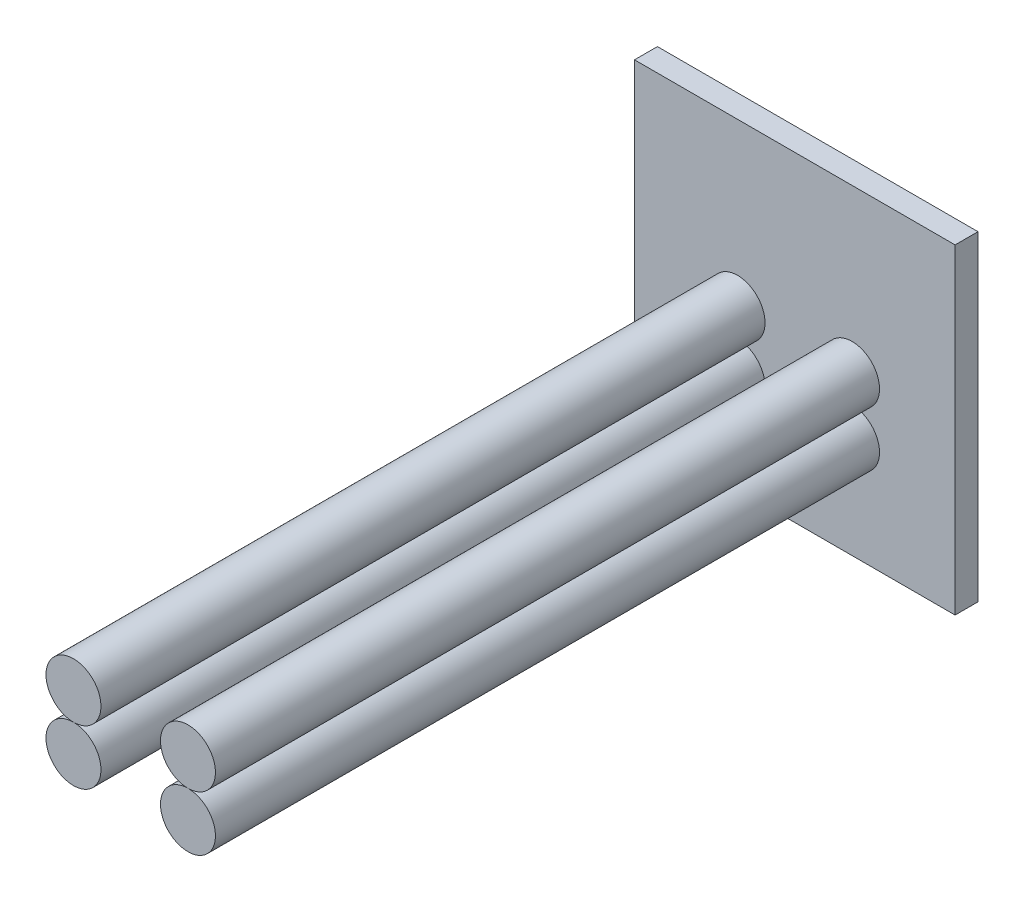
ISO-10303-21;
HEADER;
FILE_DESCRIPTION(('STEP AP214'),'2;1');
FILE_NAME('part.step','',(''),(''),'','','');
FILE_SCHEMA(('AUTOMOTIVE_DESIGN { 1 0 10303 214 1 1 1 1 }'));
ENDSEC;
DATA;
#1=APPLICATION_CONTEXT('core data for automotive mechanical design processes');
#2=APPLICATION_PROTOCOL_DEFINITION('international standard','automotive_design',2000,#1);
#3=PRODUCT_CONTEXT('',#1,'mechanical');
#4=PRODUCT('Part','Part','',(#3));
#5=PRODUCT_RELATED_PRODUCT_CATEGORY('part','',(#4));
#6=PRODUCT_DEFINITION_FORMATION('','',#4);
#7=PRODUCT_DEFINITION_CONTEXT('part definition',#1,'design');
#8=PRODUCT_DEFINITION('design','',#6,#7);
#9=PRODUCT_DEFINITION_SHAPE('','',#8);
#10=(LENGTH_UNIT() NAMED_UNIT(*) SI_UNIT(.MILLI.,.METRE.));
#11=(NAMED_UNIT(*) PLANE_ANGLE_UNIT() SI_UNIT($,.RADIAN.));
#12=(NAMED_UNIT(*) SI_UNIT($,.STERADIAN.) SOLID_ANGLE_UNIT());
#13=UNCERTAINTY_MEASURE_WITH_UNIT(LENGTH_MEASURE(1.E-05),#10,'distance_accuracy_value','');
#14=(GEOMETRIC_REPRESENTATION_CONTEXT(3) GLOBAL_UNCERTAINTY_ASSIGNED_CONTEXT((#13)) GLOBAL_UNIT_ASSIGNED_CONTEXT((#10,
#11,#12)) REPRESENTATION_CONTEXT('',''));
#15=CARTESIAN_POINT('',(0.,0.,0.));
#16=DIRECTION('',(0.,0.,1.));
#17=DIRECTION('',(1.,0.,0.));
#18=AXIS2_PLACEMENT_3D('',#15,#16,#17);
#19=CARTESIAN_POINT('',(0.,3.5,0.));
#20=DIRECTION('',(0.,0.,-1.));
#21=DIRECTION('',(0.,-1.,0.));
#22=AXIS2_PLACEMENT_3D('',#19,#20,#21);
#23=PLANE('',#22);
#24=DIRECTION('',(1.,0.,0.));
#25=VECTOR('',#24,1.);
#26=CARTESIAN_POINT('',(-3.5,7.000000000001,0.));
#27=LINE('',#26,#25);
#28=CARTESIAN_POINT('',(-3.5,7.000000000001,0.));
#29=VERTEX_POINT('',#28);
#30=CARTESIAN_POINT('',(3.5,7.000000000001,0.));
#31=VERTEX_POINT('',#30);
#32=EDGE_CURVE('E121',#29,#31,#27,.T.);
#33=ORIENTED_EDGE('',*,*,#32,.T.);
#34=DIRECTION('',(0.,-1.,0.));
#35=VECTOR('',#34,1.);
#36=CARTESIAN_POINT('',(3.5,7.000000000001,0.));
#37=LINE('',#36,#35);
#38=CARTESIAN_POINT('',(3.5,0.,0.));
#39=VERTEX_POINT('',#38);
#40=EDGE_CURVE('E107',#31,#39,#37,.T.);
#41=ORIENTED_EDGE('',*,*,#40,.T.);
#42=DIRECTION('',(-1.,0.,0.));
#43=VECTOR('',#42,1.);
#44=CARTESIAN_POINT('',(3.5,0.,0.));
#45=LINE('',#44,#43);
#46=CARTESIAN_POINT('',(-3.5,0.,0.));
#47=VERTEX_POINT('',#46);
#48=EDGE_CURVE('E162',#39,#47,#45,.T.);
#49=ORIENTED_EDGE('',*,*,#48,.T.);
#50=DIRECTION('',(0.,1.,0.));
#51=VECTOR('',#50,1.);
#52=CARTESIAN_POINT('',(-3.5,0.,0.));
#53=LINE('',#52,#51);
#54=EDGE_CURVE('E123',#47,#29,#53,.T.);
#55=ORIENTED_EDGE('',*,*,#54,.T.);
#56=EDGE_LOOP('',(#33,#41,#49,#55));
#57=FACE_BOUND('',#56,.T.);
#58=ADVANCED_FACE('F19',(#57),#23,.T.);
#59=CARTESIAN_POINT('',(-1.25,3.45,15.));
#60=DIRECTION('',(0.,0.,1.));
#61=DIRECTION('',(1.,0.,0.));
#62=AXIS2_PLACEMENT_3D('',#59,#60,#61);
#63=PLANE('',#62);
#64=CARTESIAN_POINT('',(-1.25,3.45,15.));
#65=DIRECTION('',(0.,0.,1.));
#66=DIRECTION('',(1.,0.,0.));
#67=AXIS2_PLACEMENT_3D('',#64,#65,#66);
#68=CIRCLE('',#67,0.6);
#69=CARTESIAN_POINT('',(-1.85,3.45,15.));
#70=VERTEX_POINT('',#69);
#71=EDGE_CURVE('E11',#70,#70,#68,.T.);
#72=ORIENTED_EDGE('',*,*,#71,.T.);
#73=EDGE_LOOP('',(#72));
#74=FACE_BOUND('',#73,.T.);
#75=ADVANCED_FACE('F305',(#74),#63,.T.);
#76=CARTESIAN_POINT('',(1.25,3.45,15.));
#77=DIRECTION('',(0.,0.,1.));
#78=DIRECTION('',(1.,0.,0.));
#79=AXIS2_PLACEMENT_3D('',#76,#77,#78);
#80=PLANE('',#79);
#81=CARTESIAN_POINT('',(1.25,3.45,15.));
#82=DIRECTION('',(0.,0.,1.));
#83=DIRECTION('',(1.,0.,0.));
#84=AXIS2_PLACEMENT_3D('',#81,#82,#83);
#85=CIRCLE('',#84,0.6);
#86=CARTESIAN_POINT('',(0.65,3.45,15.));
#87=VERTEX_POINT('',#86);
#88=EDGE_CURVE('E178',#87,#87,#85,.T.);
#89=ORIENTED_EDGE('',*,*,#88,.T.);
#90=EDGE_LOOP('',(#89));
#91=FACE_BOUND('',#90,.T.);
#92=ADVANCED_FACE('F313',(#91),#80,.T.);
#93=CARTESIAN_POINT('',(-1.25,2.25,15.));
#94=DIRECTION('',(0.,0.,1.));
#95=DIRECTION('',(1.,0.,0.));
#96=AXIS2_PLACEMENT_3D('',#93,#94,#95);
#97=PLANE('',#96);
#98=CARTESIAN_POINT('',(-1.25,2.25,15.));
#99=DIRECTION('',(0.,0.,1.));
#100=DIRECTION('',(1.,0.,0.));
#101=AXIS2_PLACEMENT_3D('',#98,#99,#100);
#102=CIRCLE('',#101,0.6);
#103=CARTESIAN_POINT('',(-1.85,2.25,15.));
#104=VERTEX_POINT('',#103);
#105=EDGE_CURVE('E149',#104,#104,#102,.T.);
#106=ORIENTED_EDGE('',*,*,#105,.T.);
#107=EDGE_LOOP('',(#106));
#108=FACE_BOUND('',#107,.T.);
#109=ADVANCED_FACE('F295',(#108),#97,.T.);
#110=CARTESIAN_POINT('',(1.25,2.25,15.));
#111=DIRECTION('',(0.,0.,1.));
#112=DIRECTION('',(1.,0.,0.));
#113=AXIS2_PLACEMENT_3D('',#110,#111,#112);
#114=PLANE('',#113);
#115=CARTESIAN_POINT('',(1.25,2.25,15.));
#116=DIRECTION('',(0.,0.,1.));
#117=DIRECTION('',(1.,0.,0.));
#118=AXIS2_PLACEMENT_3D('',#115,#116,#117);
#119=CIRCLE('',#118,0.6);
#120=CARTESIAN_POINT('',(0.65,2.25,15.));
#121=VERTEX_POINT('',#120);
#122=EDGE_CURVE('E150',#121,#121,#119,.T.);
#123=ORIENTED_EDGE('',*,*,#122,.T.);
#124=EDGE_LOOP('',(#123));
#125=FACE_BOUND('',#124,.T.);
#126=ADVANCED_FACE('F208',(#125),#114,.T.);
#127=CARTESIAN_POINT('',(-1.25,3.45,0.));
#128=DIRECTION('',(0.,0.,-1.));
#129=DIRECTION('',(1.,0.,0.));
#130=AXIS2_PLACEMENT_3D('',#127,#128,#129);
#131=CYLINDRICAL_SURFACE('',#130,0.6);
#132=CARTESIAN_POINT('',(-1.25,3.45,0.5));
#133=DIRECTION('',(0.,0.,-1.));
#134=DIRECTION('',(1.,0.,0.));
#135=AXIS2_PLACEMENT_3D('',#132,#133,#134);
#136=CIRCLE('',#135,0.6);
#137=CARTESIAN_POINT('',(-1.25,2.85,0.5));
#138=VERTEX_POINT('',#137);
#139=CARTESIAN_POINT('',(-1.85,3.45,0.5));
#140=VERTEX_POINT('',#139);
#141=EDGE_CURVE('E163',#138,#140,#136,.T.);
#142=ORIENTED_EDGE('',*,*,#141,.F.);
#143=CARTESIAN_POINT('',(-1.25,3.45,0.5));
#144=DIRECTION('',(0.,0.,-1.));
#145=DIRECTION('',(1.,0.,0.));
#146=AXIS2_PLACEMENT_3D('',#143,#144,#145);
#147=CIRCLE('',#146,0.6);
#148=EDGE_CURVE('E159',#140,#138,#147,.T.);
#149=ORIENTED_EDGE('',*,*,#148,.F.);
#150=DIRECTION('',(0.,0.,1.));
#151=VECTOR('',#150,1.);
#152=CARTESIAN_POINT('',(-1.85,3.45,0.));
#153=LINE('',#152,#151);
#154=EDGE_CURVE('E30',#140,#70,#153,.T.);
#155=ORIENTED_EDGE('',*,*,#154,.T.);
#156=ORIENTED_EDGE('',*,*,#71,.F.);
#157=ORIENTED_EDGE('',*,*,#154,.F.);
#158=EDGE_LOOP('',(#142,#149,#155,#156,#157));
#159=FACE_BOUND('',#158,.T.);
#160=ADVANCED_FACE('F294',(#159),#131,.T.);
#161=CARTESIAN_POINT('',(1.25,3.45,0.));
#162=DIRECTION('',(0.,0.,-1.));
#163=DIRECTION('',(1.,0.,0.));
#164=AXIS2_PLACEMENT_3D('',#161,#162,#163);
#165=CYLINDRICAL_SURFACE('',#164,0.6);
#166=CARTESIAN_POINT('',(1.25,3.45,0.5));
#167=DIRECTION('',(0.,0.,-1.));
#168=DIRECTION('',(1.,0.,0.));
#169=AXIS2_PLACEMENT_3D('',#166,#167,#168);
#170=CIRCLE('',#169,0.6);
#171=CARTESIAN_POINT('',(1.25,2.85,0.5));
#172=VERTEX_POINT('',#171);
#173=CARTESIAN_POINT('',(0.65,3.45,0.5));
#174=VERTEX_POINT('',#173);
#175=EDGE_CURVE('E151',#172,#174,#170,.T.);
#176=ORIENTED_EDGE('',*,*,#175,.F.);
#177=CARTESIAN_POINT('',(1.25,3.45,0.5));
#178=DIRECTION('',(0.,0.,-1.));
#179=DIRECTION('',(1.,0.,0.));
#180=AXIS2_PLACEMENT_3D('',#177,#178,#179);
#181=CIRCLE('',#180,0.6);
#182=EDGE_CURVE('E143',#174,#172,#181,.T.);
#183=ORIENTED_EDGE('',*,*,#182,.F.);
#184=DIRECTION('',(0.,0.,1.));
#185=VECTOR('',#184,1.);
#186=CARTESIAN_POINT('',(0.65,3.45,0.));
#187=LINE('',#186,#185);
#188=EDGE_CURVE('E180',#174,#87,#187,.T.);
#189=ORIENTED_EDGE('',*,*,#188,.T.);
#190=ORIENTED_EDGE('',*,*,#88,.F.);
#191=ORIENTED_EDGE('',*,*,#188,.F.);
#192=EDGE_LOOP('',(#176,#183,#189,#190,#191));
#193=FACE_BOUND('',#192,.T.);
#194=ADVANCED_FACE('F336',(#193),#165,.T.);
#195=CARTESIAN_POINT('',(-1.25,2.25,0.));
#196=DIRECTION('',(0.,0.,-1.));
#197=DIRECTION('',(1.,0.,0.));
#198=AXIS2_PLACEMENT_3D('',#195,#196,#197);
#199=CYLINDRICAL_SURFACE('',#198,0.6);
#200=CARTESIAN_POINT('',(-1.25,2.25,0.5));
#201=DIRECTION('',(0.,0.,-1.));
#202=DIRECTION('',(1.,0.,0.));
#203=AXIS2_PLACEMENT_3D('',#200,#201,#202);
#204=CIRCLE('',#203,0.6);
#205=CARTESIAN_POINT('',(-1.85,2.25,0.5));
#206=VERTEX_POINT('',#205);
#207=EDGE_CURVE('E167',#138,#206,#204,.T.);
#208=ORIENTED_EDGE('',*,*,#207,.F.);
#209=CARTESIAN_POINT('',(-1.25,2.25,0.5));
#210=DIRECTION('',(0.,0.,-1.));
#211=DIRECTION('',(1.,0.,0.));
#212=AXIS2_PLACEMENT_3D('',#209,#210,#211);
#213=CIRCLE('',#212,0.6);
#214=EDGE_CURVE('E171',#206,#138,#213,.T.);
#215=ORIENTED_EDGE('',*,*,#214,.F.);
#216=DIRECTION('',(0.,0.,1.));
#217=VECTOR('',#216,1.);
#218=CARTESIAN_POINT('',(-1.85,2.25,0.));
#219=LINE('',#218,#217);
#220=EDGE_CURVE('E145',#206,#104,#219,.T.);
#221=ORIENTED_EDGE('',*,*,#220,.T.);
#222=ORIENTED_EDGE('',*,*,#105,.F.);
#223=ORIENTED_EDGE('',*,*,#220,.F.);
#224=EDGE_LOOP('',(#208,#215,#221,#222,#223));
#225=FACE_BOUND('',#224,.T.);
#226=ADVANCED_FACE('F341',(#225),#199,.T.);
#227=CARTESIAN_POINT('',(1.25,2.25,0.));
#228=DIRECTION('',(0.,0.,-1.));
#229=DIRECTION('',(1.,0.,0.));
#230=AXIS2_PLACEMENT_3D('',#227,#228,#229);
#231=CYLINDRICAL_SURFACE('',#230,0.6);
#232=CARTESIAN_POINT('',(1.25,2.25,0.5));
#233=DIRECTION('',(0.,0.,-1.));
#234=DIRECTION('',(1.,0.,0.));
#235=AXIS2_PLACEMENT_3D('',#232,#233,#234);
#236=CIRCLE('',#235,0.6);
#237=CARTESIAN_POINT('',(0.65,2.25,0.5));
#238=VERTEX_POINT('',#237);
#239=EDGE_CURVE('E166',#172,#238,#236,.T.);
#240=ORIENTED_EDGE('',*,*,#239,.F.);
#241=CARTESIAN_POINT('',(1.25,2.25,0.5));
#242=DIRECTION('',(0.,0.,-1.));
#243=DIRECTION('',(1.,0.,0.));
#244=AXIS2_PLACEMENT_3D('',#241,#242,#243);
#245=CIRCLE('',#244,0.6);
#246=EDGE_CURVE('E23',#238,#172,#245,.T.);
#247=ORIENTED_EDGE('',*,*,#246,.F.);
#248=DIRECTION('',(0.,0.,1.));
#249=VECTOR('',#248,1.);
#250=CARTESIAN_POINT('',(0.65,2.25,0.));
#251=LINE('',#250,#249);
#252=EDGE_CURVE('E199',#238,#121,#251,.T.);
#253=ORIENTED_EDGE('',*,*,#252,.T.);
#254=ORIENTED_EDGE('',*,*,#122,.F.);
#255=ORIENTED_EDGE('',*,*,#252,.F.);
#256=EDGE_LOOP('',(#240,#247,#253,#254,#255));
#257=FACE_BOUND('',#256,.T.);
#258=ADVANCED_FACE('F21',(#257),#231,.T.);
#259=CARTESIAN_POINT('',(3.5,0.,0.));
#260=DIRECTION('',(0.,-1.,0.));
#261=DIRECTION('',(0.,0.,-1.));
#262=AXIS2_PLACEMENT_3D('',#259,#260,#261);
#263=PLANE('',#262);
#264=DIRECTION('',(0.,0.,1.));
#265=VECTOR('',#264,1.);
#266=CARTESIAN_POINT('',(3.5,0.,0.));
#267=LINE('',#266,#265);
#268=CARTESIAN_POINT('',(3.5,0.,0.5));
#269=VERTEX_POINT('',#268);
#270=EDGE_CURVE('E115',#39,#269,#267,.T.);
#271=ORIENTED_EDGE('',*,*,#270,.T.);
#272=DIRECTION('',(-1.,0.,0.));
#273=VECTOR('',#272,1.);
#274=CARTESIAN_POINT('',(3.5,0.,0.5));
#275=LINE('',#274,#273);
#276=CARTESIAN_POINT('',(-3.5,0.,0.5));
#277=VERTEX_POINT('',#276);
#278=EDGE_CURVE('E118',#269,#277,#275,.T.);
#279=ORIENTED_EDGE('',*,*,#278,.T.);
#280=DIRECTION('',(0.,0.,1.));
#281=VECTOR('',#280,1.);
#282=CARTESIAN_POINT('',(-3.5,0.,0.));
#283=LINE('',#282,#281);
#284=EDGE_CURVE('E128',#47,#277,#283,.T.);
#285=ORIENTED_EDGE('',*,*,#284,.F.);
#286=ORIENTED_EDGE('',*,*,#48,.F.);
#287=EDGE_LOOP('',(#271,#279,#285,#286));
#288=FACE_BOUND('',#287,.T.);
#289=ADVANCED_FACE('F238',(#288),#263,.T.);
#290=CARTESIAN_POINT('',(0.,3.5,0.5));
#291=DIRECTION('',(0.,0.,-1.));
#292=DIRECTION('',(0.,-1.,0.));
#293=AXIS2_PLACEMENT_3D('',#290,#291,#292);
#294=PLANE('',#293);
#295=ORIENTED_EDGE('',*,*,#207,.T.);
#296=ORIENTED_EDGE('',*,*,#214,.T.);
#297=ORIENTED_EDGE('',*,*,#141,.T.);
#298=ORIENTED_EDGE('',*,*,#148,.T.);
#299=EDGE_LOOP('',(#295,#296,#297,#298));
#300=FACE_BOUND('',#299,.T.);
#301=ORIENTED_EDGE('',*,*,#239,.T.);
#302=ORIENTED_EDGE('',*,*,#246,.T.);
#303=ORIENTED_EDGE('',*,*,#175,.T.);
#304=ORIENTED_EDGE('',*,*,#182,.T.);
#305=EDGE_LOOP('',(#301,#302,#303,#304));
#306=FACE_BOUND('',#305,.T.);
#307=DIRECTION('',(1.,0.,0.));
#308=VECTOR('',#307,1.);
#309=CARTESIAN_POINT('',(-3.5,7.000000000001,0.5));
#310=LINE('',#309,#308);
#311=CARTESIAN_POINT('',(-3.5,7.000000000001,0.5));
#312=VERTEX_POINT('',#311);
#313=CARTESIAN_POINT('',(3.5,7.000000000001,0.5));
#314=VERTEX_POINT('',#313);
#315=EDGE_CURVE('E132',#312,#314,#310,.T.);
#316=ORIENTED_EDGE('',*,*,#315,.F.);
#317=DIRECTION('',(0.,1.,0.));
#318=VECTOR('',#317,1.);
#319=CARTESIAN_POINT('',(-3.5,0.,0.5));
#320=LINE('',#319,#318);
#321=EDGE_CURVE('E158',#277,#312,#320,.T.);
#322=ORIENTED_EDGE('',*,*,#321,.F.);
#323=ORIENTED_EDGE('',*,*,#278,.F.);
#324=DIRECTION('',(0.,-1.,0.));
#325=VECTOR('',#324,1.);
#326=CARTESIAN_POINT('',(3.5,7.000000000001,0.5));
#327=LINE('',#326,#325);
#328=EDGE_CURVE('E173',#314,#269,#327,.T.);
#329=ORIENTED_EDGE('',*,*,#328,.F.);
#330=EDGE_LOOP('',(#316,#322,#323,#329));
#331=FACE_BOUND('',#330,.T.);
#332=ADVANCED_FACE('F216',(#300,#306,#331),#294,.F.);
#333=CARTESIAN_POINT('',(3.5,7.000000000001,0.));
#334=DIRECTION('',(1.,0.,0.));
#335=DIRECTION('',(0.,1.,0.));
#336=AXIS2_PLACEMENT_3D('',#333,#334,#335);
#337=PLANE('',#336);
#338=DIRECTION('',(0.,0.,1.));
#339=VECTOR('',#338,1.);
#340=CARTESIAN_POINT('',(3.5,7.000000000001,0.));
#341=LINE('',#340,#339);
#342=EDGE_CURVE('E112',#31,#314,#341,.T.);
#343=ORIENTED_EDGE('',*,*,#342,.T.);
#344=ORIENTED_EDGE('',*,*,#328,.T.);
#345=ORIENTED_EDGE('',*,*,#270,.F.);
#346=ORIENTED_EDGE('',*,*,#40,.F.);
#347=EDGE_LOOP('',(#343,#344,#345,#346));
#348=FACE_BOUND('',#347,.T.);
#349=ADVANCED_FACE('F109',(#348),#337,.T.);
#350=CARTESIAN_POINT('',(-3.5,0.,0.));
#351=DIRECTION('',(-1.,0.,0.));
#352=DIRECTION('',(0.,0.,1.));
#353=AXIS2_PLACEMENT_3D('',#350,#351,#352);
#354=PLANE('',#353);
#355=ORIENTED_EDGE('',*,*,#284,.T.);
#356=ORIENTED_EDGE('',*,*,#321,.T.);
#357=DIRECTION('',(0.,0.,1.));
#358=VECTOR('',#357,1.);
#359=CARTESIAN_POINT('',(-3.5,7.000000000001,0.));
#360=LINE('',#359,#358);
#361=EDGE_CURVE('E139',#29,#312,#360,.T.);
#362=ORIENTED_EDGE('',*,*,#361,.F.);
#363=ORIENTED_EDGE('',*,*,#54,.F.);
#364=EDGE_LOOP('',(#355,#356,#362,#363));
#365=FACE_BOUND('',#364,.T.);
#366=ADVANCED_FACE('F285',(#365),#354,.T.);
#367=CARTESIAN_POINT('',(-3.5,7.000000000001,0.));
#368=DIRECTION('',(0.,1.,0.));
#369=DIRECTION('',(1.,0.,0.));
#370=AXIS2_PLACEMENT_3D('',#367,#368,#369);
#371=PLANE('',#370);
#372=ORIENTED_EDGE('',*,*,#361,.T.);
#373=ORIENTED_EDGE('',*,*,#315,.T.);
#374=ORIENTED_EDGE('',*,*,#342,.F.);
#375=ORIENTED_EDGE('',*,*,#32,.F.);
#376=EDGE_LOOP('',(#372,#373,#374,#375));
#377=FACE_BOUND('',#376,.T.);
#378=ADVANCED_FACE('F130',(#377),#371,.T.);
#379=CLOSED_SHELL('',(#58,#75,#92,#109,#126,#160,#194,#226,#258,#289,#332,#349,#366,#378));
#380=MANIFOLD_SOLID_BREP('B1',#379);
#381=ADVANCED_BREP_SHAPE_REPRESENTATION('',(#18,#380),#14);
#382=SHAPE_DEFINITION_REPRESENTATION(#9,#381);
ENDSEC;
END-ISO-10303-21;
